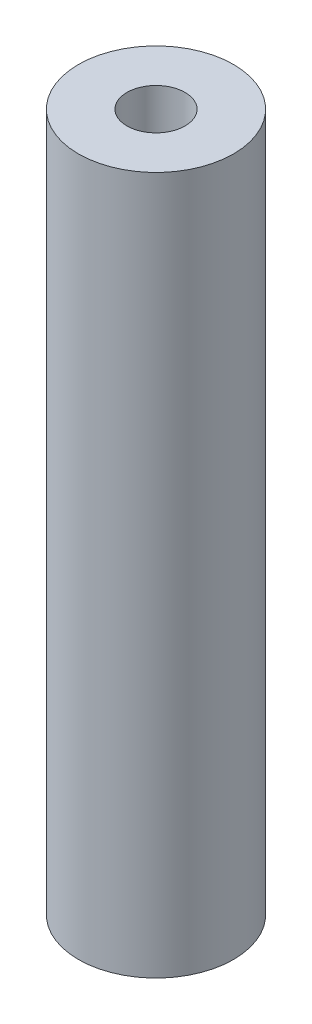
ISO-10303-21;
HEADER;
FILE_DESCRIPTION(('STEP AP214'),'2;1');
FILE_NAME('part.step','',(''),(''),'','','');
FILE_SCHEMA(('AUTOMOTIVE_DESIGN { 1 0 10303 214 1 1 1 1 }'));
ENDSEC;
DATA;
#1=APPLICATION_CONTEXT('core data for automotive mechanical design processes');
#2=APPLICATION_PROTOCOL_DEFINITION('international standard','automotive_design',2000,#1);
#3=PRODUCT_CONTEXT('',#1,'mechanical');
#4=PRODUCT('Part','Part','',(#3));
#5=PRODUCT_RELATED_PRODUCT_CATEGORY('part','',(#4));
#6=PRODUCT_DEFINITION_FORMATION('','',#4);
#7=PRODUCT_DEFINITION_CONTEXT('part definition',#1,'design');
#8=PRODUCT_DEFINITION('design','',#6,#7);
#9=PRODUCT_DEFINITION_SHAPE('','',#8);
#10=(LENGTH_UNIT() NAMED_UNIT(*) SI_UNIT(.MILLI.,.METRE.));
#11=(NAMED_UNIT(*) PLANE_ANGLE_UNIT() SI_UNIT($,.RADIAN.));
#12=(NAMED_UNIT(*) SI_UNIT($,.STERADIAN.) SOLID_ANGLE_UNIT());
#13=UNCERTAINTY_MEASURE_WITH_UNIT(LENGTH_MEASURE(1.E-05),#10,'distance_accuracy_value','');
#14=(GEOMETRIC_REPRESENTATION_CONTEXT(3) GLOBAL_UNCERTAINTY_ASSIGNED_CONTEXT((#13)) GLOBAL_UNIT_ASSIGNED_CONTEXT((#10,
#11,#12)) REPRESENTATION_CONTEXT('',''));
#15=CARTESIAN_POINT('',(0.,0.,0.));
#16=DIRECTION('',(0.,0.,1.));
#17=DIRECTION('',(1.,0.,0.));
#18=AXIS2_PLACEMENT_3D('',#15,#16,#17);
#19=CARTESIAN_POINT('',(0.,18.,0.));
#20=DIRECTION('',(0.,1.,0.));
#21=DIRECTION('',(0.,0.,1.));
#22=AXIS2_PLACEMENT_3D('',#19,#20,#21);
#23=PLANE('',#22);
#24=CARTESIAN_POINT('',(0.,18.,0.));
#25=DIRECTION('',(0.,1.,0.));
#26=DIRECTION('',(0.,0.,1.));
#27=AXIS2_PLACEMENT_3D('',#24,#25,#26);
#28=CIRCLE('',#27,2.);
#29=CARTESIAN_POINT('',(0.,18.,2.));
#30=VERTEX_POINT('',#29);
#31=EDGE_CURVE('E11',#30,#30,#28,.T.);
#32=ORIENTED_EDGE('',*,*,#31,.T.);
#33=EDGE_LOOP('',(#32));
#34=FACE_BOUND('',#33,.T.);
#35=CARTESIAN_POINT('',(0.,18.,0.));
#36=DIRECTION('',(0.,1.,0.));
#37=DIRECTION('',(0.,0.,1.));
#38=AXIS2_PLACEMENT_3D('',#35,#36,#37);
#39=CIRCLE('',#38,0.75);
#40=CARTESIAN_POINT('',(0.,18.,0.75));
#41=VERTEX_POINT('',#40);
#42=EDGE_CURVE('E50',#41,#41,#39,.T.);
#43=ORIENTED_EDGE('',*,*,#42,.F.);
#44=EDGE_LOOP('',(#43));
#45=FACE_BOUND('',#44,.T.);
#46=ADVANCED_FACE('F39',(#34,#45),#23,.T.);
#47=CARTESIAN_POINT('',(0.,0.,0.));
#48=DIRECTION('',(0.,1.,0.));
#49=DIRECTION('',(0.,0.,1.));
#50=AXIS2_PLACEMENT_3D('',#47,#48,#49);
#51=PLANE('',#50);
#52=CARTESIAN_POINT('',(0.,0.,0.));
#53=DIRECTION('',(0.,1.,0.));
#54=DIRECTION('',(0.,0.,1.));
#55=AXIS2_PLACEMENT_3D('',#52,#53,#54);
#56=CIRCLE('',#55,2.);
#57=CARTESIAN_POINT('',(0.,0.,2.));
#58=VERTEX_POINT('',#57);
#59=EDGE_CURVE('E43',#58,#58,#56,.T.);
#60=ORIENTED_EDGE('',*,*,#59,.F.);
#61=EDGE_LOOP('',(#60));
#62=FACE_BOUND('',#61,.T.);
#63=CARTESIAN_POINT('',(0.,0.,0.));
#64=DIRECTION('',(0.,1.,0.));
#65=DIRECTION('',(0.,0.,1.));
#66=AXIS2_PLACEMENT_3D('',#63,#64,#65);
#67=CIRCLE('',#66,0.75);
#68=CARTESIAN_POINT('',(0.,0.,0.75));
#69=VERTEX_POINT('',#68);
#70=EDGE_CURVE('E52',#69,#69,#67,.T.);
#71=ORIENTED_EDGE('',*,*,#70,.T.);
#72=EDGE_LOOP('',(#71));
#73=FACE_BOUND('',#72,.T.);
#74=ADVANCED_FACE('F62',(#62,#73),#51,.F.);
#75=CARTESIAN_POINT('',(0.,18.,0.));
#76=DIRECTION('',(0.,-1.,0.));
#77=DIRECTION('',(0.,0.,-1.));
#78=AXIS2_PLACEMENT_3D('',#75,#76,#77);
#79=CYLINDRICAL_SURFACE('',#78,2.);
#80=ORIENTED_EDGE('',*,*,#31,.F.);
#81=EDGE_LOOP('',(#80));
#82=FACE_BOUND('',#81,.T.);
#83=ORIENTED_EDGE('',*,*,#59,.T.);
#84=EDGE_LOOP('',(#83));
#85=FACE_BOUND('',#84,.T.);
#86=ADVANCED_FACE('F41',(#82,#85),#79,.T.);
#87=CARTESIAN_POINT('',(0.,18.,0.));
#88=DIRECTION('',(0.,-1.,0.));
#89=DIRECTION('',(0.,0.,-1.));
#90=AXIS2_PLACEMENT_3D('',#87,#88,#89);
#91=CYLINDRICAL_SURFACE('',#90,0.75);
#92=ORIENTED_EDGE('',*,*,#42,.T.);
#93=EDGE_LOOP('',(#92));
#94=FACE_BOUND('',#93,.T.);
#95=ORIENTED_EDGE('',*,*,#70,.F.);
#96=EDGE_LOOP('',(#95));
#97=FACE_BOUND('',#96,.T.);
#98=ADVANCED_FACE('F58',(#94,#97),#91,.F.);
#99=CLOSED_SHELL('',(#46,#74,#86,#98));
#100=MANIFOLD_SOLID_BREP('B2',#99);
#101=ADVANCED_BREP_SHAPE_REPRESENTATION('',(#18,#100),#14);
#102=SHAPE_DEFINITION_REPRESENTATION(#9,#101);
ENDSEC;
END-ISO-10303-21;
